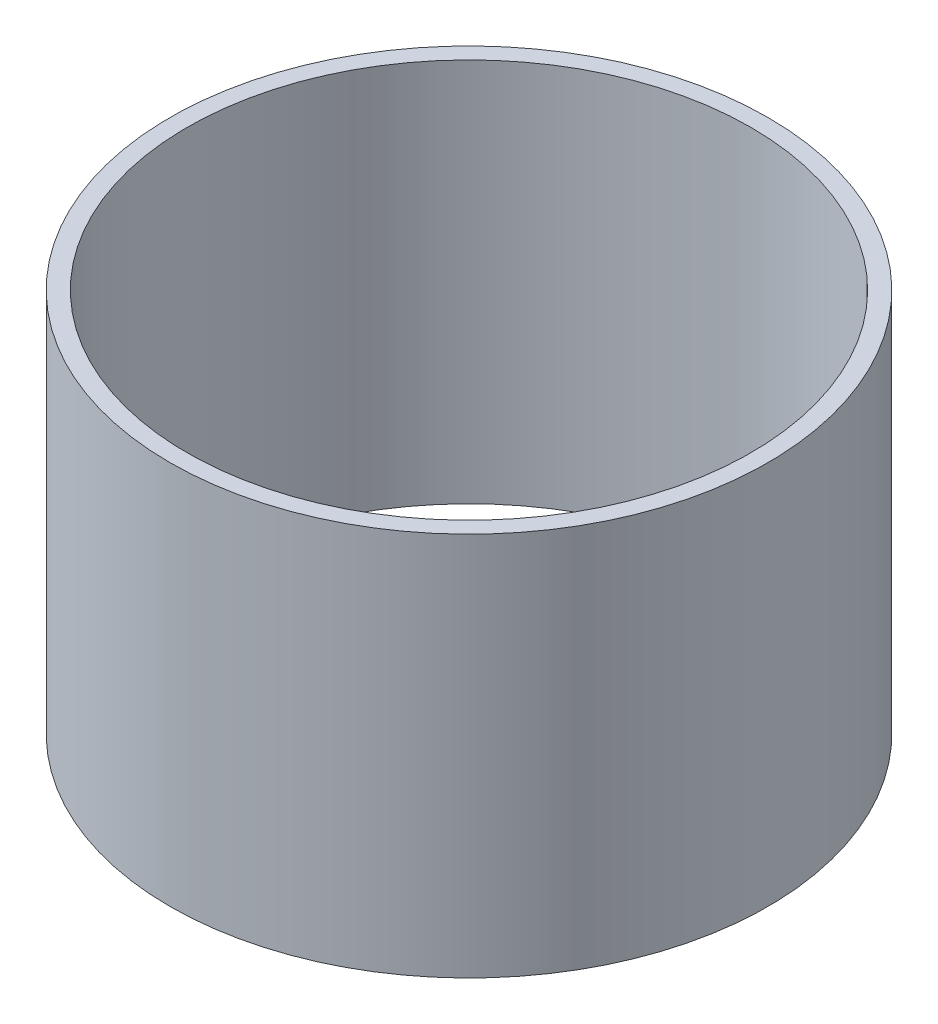
ISO-10303-21;
HEADER;
FILE_DESCRIPTION(('STEP AP214'),'2;1');
FILE_NAME('part.step','',(''),(''),'','','');
FILE_SCHEMA(('AUTOMOTIVE_DESIGN { 1 0 10303 214 1 1 1 1 }'));
ENDSEC;
DATA;
#1=APPLICATION_CONTEXT('core data for automotive mechanical design processes');
#2=APPLICATION_PROTOCOL_DEFINITION('international standard','automotive_design',2000,#1);
#3=PRODUCT_CONTEXT('',#1,'mechanical');
#4=PRODUCT('Part','Part','',(#3));
#5=PRODUCT_RELATED_PRODUCT_CATEGORY('part','',(#4));
#6=PRODUCT_DEFINITION_FORMATION('','',#4);
#7=PRODUCT_DEFINITION_CONTEXT('part definition',#1,'design');
#8=PRODUCT_DEFINITION('design','',#6,#7);
#9=PRODUCT_DEFINITION_SHAPE('','',#8);
#10=(LENGTH_UNIT() NAMED_UNIT(*) SI_UNIT(.MILLI.,.METRE.));
#11=(NAMED_UNIT(*) PLANE_ANGLE_UNIT() SI_UNIT($,.RADIAN.));
#12=(NAMED_UNIT(*) SI_UNIT($,.STERADIAN.) SOLID_ANGLE_UNIT());
#13=UNCERTAINTY_MEASURE_WITH_UNIT(LENGTH_MEASURE(1.E-05),#10,'distance_accuracy_value','');
#14=(GEOMETRIC_REPRESENTATION_CONTEXT(3) GLOBAL_UNCERTAINTY_ASSIGNED_CONTEXT((#13)) GLOBAL_UNIT_ASSIGNED_CONTEXT((#10,
#11,#12)) REPRESENTATION_CONTEXT('',''));
#15=CARTESIAN_POINT('',(0.,0.,0.));
#16=DIRECTION('',(0.,0.,1.));
#17=DIRECTION('',(1.,0.,0.));
#18=AXIS2_PLACEMENT_3D('',#15,#16,#17);
#19=CARTESIAN_POINT('',(0.,90.,0.));
#20=DIRECTION('',(0.,1.,0.));
#21=DIRECTION('',(0.,0.,1.));
#22=AXIS2_PLACEMENT_3D('',#19,#20,#21);
#23=PLANE('',#22);
#24=CARTESIAN_POINT('',(0.,90.,0.));
#25=DIRECTION('',(0.,1.,0.));
#26=DIRECTION('',(0.,0.,1.));
#27=AXIS2_PLACEMENT_3D('',#24,#25,#26);
#28=CIRCLE('',#27,70.);
#29=CARTESIAN_POINT('',(0.,90.,-70.));
#30=VERTEX_POINT('',#29);
#31=EDGE_CURVE('E10',#30,#30,#28,.T.);
#32=ORIENTED_EDGE('',*,*,#31,.T.);
#33=EDGE_LOOP('',(#32));
#34=FACE_BOUND('',#33,.T.);
#35=CARTESIAN_POINT('',(0.,90.,0.));
#36=DIRECTION('',(0.,1.,0.));
#37=DIRECTION('',(0.,0.,1.));
#38=AXIS2_PLACEMENT_3D('',#35,#36,#37);
#39=CIRCLE('',#38,66.);
#40=CARTESIAN_POINT('',(0.,90.,-66.));
#41=VERTEX_POINT('',#40);
#42=EDGE_CURVE('E46',#41,#41,#39,.T.);
#43=ORIENTED_EDGE('',*,*,#42,.F.);
#44=EDGE_LOOP('',(#43));
#45=FACE_BOUND('',#44,.T.);
#46=ADVANCED_FACE('F35',(#34,#45),#23,.T.);
#47=CARTESIAN_POINT('',(0.,0.,0.));
#48=DIRECTION('',(0.,1.,0.));
#49=DIRECTION('',(0.,0.,1.));
#50=AXIS2_PLACEMENT_3D('',#47,#48,#49);
#51=PLANE('',#50);
#52=CARTESIAN_POINT('',(0.,0.,0.));
#53=DIRECTION('',(0.,1.,0.));
#54=DIRECTION('',(0.,0.,1.));
#55=AXIS2_PLACEMENT_3D('',#52,#53,#54);
#56=CIRCLE('',#55,70.);
#57=CARTESIAN_POINT('',(0.,0.,-70.));
#58=VERTEX_POINT('',#57);
#59=EDGE_CURVE('E39',#58,#58,#56,.T.);
#60=ORIENTED_EDGE('',*,*,#59,.F.);
#61=EDGE_LOOP('',(#60));
#62=FACE_BOUND('',#61,.T.);
#63=CARTESIAN_POINT('',(0.,0.,0.));
#64=DIRECTION('',(0.,1.,0.));
#65=DIRECTION('',(0.,0.,1.));
#66=AXIS2_PLACEMENT_3D('',#63,#64,#65);
#67=CIRCLE('',#66,66.);
#68=CARTESIAN_POINT('',(0.,0.,-66.));
#69=VERTEX_POINT('',#68);
#70=EDGE_CURVE('E48',#69,#69,#67,.T.);
#71=ORIENTED_EDGE('',*,*,#70,.T.);
#72=EDGE_LOOP('',(#71));
#73=FACE_BOUND('',#72,.T.);
#74=ADVANCED_FACE('F58',(#62,#73),#51,.F.);
#75=CARTESIAN_POINT('',(0.,90.,0.));
#76=DIRECTION('',(0.,-1.,0.));
#77=DIRECTION('',(0.,0.,-1.));
#78=AXIS2_PLACEMENT_3D('',#75,#76,#77);
#79=CYLINDRICAL_SURFACE('',#78,70.);
#80=CARTESIAN_POINT('',(0.,90.,-70.));
#81=CARTESIAN_POINT('',(0.,89.0625,-70.));
#82=CARTESIAN_POINT('',(0.,88.125,-70.));
#83=CARTESIAN_POINT('',(0.,86.25,-70.));
#84=CARTESIAN_POINT('',(0.,85.3125,-70.));
#85=CARTESIAN_POINT('',(0.,83.4375,-70.));
#86=CARTESIAN_POINT('',(0.,82.5,-70.));
#87=CARTESIAN_POINT('',(0.,80.625,-70.));
#88=CARTESIAN_POINT('',(0.,79.6875,-70.));
#89=CARTESIAN_POINT('',(0.,77.8125,-70.));
#90=CARTESIAN_POINT('',(0.,76.875,-70.));
#91=CARTESIAN_POINT('',(0.,75.,-70.));
#92=CARTESIAN_POINT('',(0.,74.0625,-70.));
#93=CARTESIAN_POINT('',(0.,72.1875,-70.));
#94=CARTESIAN_POINT('',(0.,71.25,-70.));
#95=CARTESIAN_POINT('',(0.,69.375,-70.));
#96=CARTESIAN_POINT('',(0.,68.4375,-70.));
#97=CARTESIAN_POINT('',(0.,66.5625,-70.));
#98=CARTESIAN_POINT('',(0.,65.625,-70.));
#99=CARTESIAN_POINT('',(0.,63.75,-70.));
#100=CARTESIAN_POINT('',(0.,62.8125,-70.));
#101=CARTESIAN_POINT('',(0.,60.9375,-70.));
#102=CARTESIAN_POINT('',(0.,60.,-70.));
#103=CARTESIAN_POINT('',(0.,58.125,-70.));
#104=CARTESIAN_POINT('',(0.,57.1875,-70.));
#105=CARTESIAN_POINT('',(0.,55.3125,-70.));
#106=CARTESIAN_POINT('',(0.,54.375,-70.));
#107=CARTESIAN_POINT('',(0.,52.5,-70.));
#108=CARTESIAN_POINT('',(0.,51.5625,-70.));
#109=CARTESIAN_POINT('',(0.,49.6875,-70.));
#110=CARTESIAN_POINT('',(0.,48.75,-70.));
#111=CARTESIAN_POINT('',(0.,46.875,-70.));
#112=CARTESIAN_POINT('',(0.,45.9375,-70.));
#113=CARTESIAN_POINT('',(0.,44.0625,-70.));
#114=CARTESIAN_POINT('',(0.,43.125,-70.));
#115=CARTESIAN_POINT('',(0.,41.25,-70.));
#116=CARTESIAN_POINT('',(0.,40.3125,-70.));
#117=CARTESIAN_POINT('',(0.,38.4375,-70.));
#118=CARTESIAN_POINT('',(0.,37.5,-70.));
#119=CARTESIAN_POINT('',(0.,35.625,-70.));
#120=CARTESIAN_POINT('',(0.,34.6875,-70.));
#121=CARTESIAN_POINT('',(0.,32.8125,-70.));
#122=CARTESIAN_POINT('',(0.,31.875,-70.));
#123=CARTESIAN_POINT('',(0.,30.,-70.));
#124=CARTESIAN_POINT('',(0.,29.0625,-70.));
#125=CARTESIAN_POINT('',(0.,27.1875,-70.));
#126=CARTESIAN_POINT('',(0.,26.25,-70.));
#127=CARTESIAN_POINT('',(0.,24.375,-70.));
#128=CARTESIAN_POINT('',(0.,23.4375,-70.));
#129=CARTESIAN_POINT('',(0.,21.5625,-70.));
#130=CARTESIAN_POINT('',(0.,20.625,-70.));
#131=CARTESIAN_POINT('',(0.,18.75,-70.));
#132=CARTESIAN_POINT('',(0.,17.8125,-70.));
#133=CARTESIAN_POINT('',(0.,15.9375,-70.));
#134=CARTESIAN_POINT('',(0.,15.,-70.));
#135=CARTESIAN_POINT('',(0.,13.125,-70.));
#136=CARTESIAN_POINT('',(0.,12.1875,-70.));
#137=CARTESIAN_POINT('',(0.,10.3125,-70.));
#138=CARTESIAN_POINT('',(0.,9.37499999999999,-70.));
#139=CARTESIAN_POINT('',(0.,7.49999999999999,-70.));
#140=CARTESIAN_POINT('',(0.,6.56249999999999,-70.));
#141=CARTESIAN_POINT('',(0.,4.68749999999999,-70.));
#142=CARTESIAN_POINT('',(0.,3.74999999999998,-70.));
#143=CARTESIAN_POINT('',(0.,1.87499999999998,-70.));
#144=CARTESIAN_POINT('',(0.,0.937499999999986,-70.));
#145=CARTESIAN_POINT('',(0.,0.,-70.));
#146=B_SPLINE_CURVE_WITH_KNOTS('',3,(#80,#81,#82,#83,#84,#85,#86,#87,#88,#89,#90,#91,#92,#93,
#94,#95,#96,#97,#98,#99,#100,#101,#102,#103,#104,#105,#106,#107,#108,#109,#110,#111,#112,#113,
#114,#115,#116,#117,#118,#119,#120,#121,#122,#123,#124,#125,#126,#127,#128,#129,#130,#131,#132,
#133,#134,#135,#136,#137,#138,#139,#140,#141,#142,#143,#144,#145),.UNSPECIFIED.,.F.,.F.,(4,2,2,
2,2,2,2,2,2,2,2,2,2,2,2,2,2,2,2,2,2,2,2,2,2,2,2,2,2,2,2,2,4),(0.,2.8125,5.62499999999999,
8.43749999999999,11.25,14.0625,16.875,19.6875,22.5,25.3125,28.125,30.9375,33.75,36.5625,39.375,
42.1875,45.,47.8125,50.625,53.4375,56.25,59.0625,61.875,64.6875,67.5,70.3125,73.125,75.9375,
78.75,81.5625,84.375,87.1875,90.),.UNSPECIFIED.);
#147=EDGE_CURVE('BSEAM37',#30,#58,#146,.T.);
#148=ORIENTED_EDGE('',*,*,#31,.F.);
#149=ORIENTED_EDGE('',*,*,#59,.T.);
#150=ORIENTED_EDGE('',*,*,#147,.T.);
#151=ORIENTED_EDGE('',*,*,#147,.F.);
#152=EDGE_LOOP('',(#148,#150,#149,#151));
#153=FACE_BOUND('',#152,.T.);
#154=ADVANCED_FACE('F37',(#153),#79,.T.);
#155=CARTESIAN_POINT('',(0.,90.,0.));
#156=DIRECTION('',(0.,-1.,0.));
#157=DIRECTION('',(0.,0.,-1.));
#158=AXIS2_PLACEMENT_3D('',#155,#156,#157);
#159=CYLINDRICAL_SURFACE('',#158,66.);
#160=CARTESIAN_POINT('',(0.,90.,-66.));
#161=CARTESIAN_POINT('',(0.,89.0625,-66.));
#162=CARTESIAN_POINT('',(0.,88.125,-66.));
#163=CARTESIAN_POINT('',(0.,86.25,-66.));
#164=CARTESIAN_POINT('',(0.,85.3125,-66.));
#165=CARTESIAN_POINT('',(0.,83.4375,-66.));
#166=CARTESIAN_POINT('',(0.,82.5,-66.));
#167=CARTESIAN_POINT('',(0.,80.625,-66.));
#168=CARTESIAN_POINT('',(0.,79.6875,-66.));
#169=CARTESIAN_POINT('',(0.,77.8125,-66.));
#170=CARTESIAN_POINT('',(0.,76.875,-66.));
#171=CARTESIAN_POINT('',(0.,75.,-66.));
#172=CARTESIAN_POINT('',(0.,74.0625,-66.));
#173=CARTESIAN_POINT('',(0.,72.1875,-66.));
#174=CARTESIAN_POINT('',(0.,71.25,-66.));
#175=CARTESIAN_POINT('',(0.,69.375,-66.));
#176=CARTESIAN_POINT('',(0.,68.4375,-66.));
#177=CARTESIAN_POINT('',(0.,66.5625,-66.));
#178=CARTESIAN_POINT('',(0.,65.625,-66.));
#179=CARTESIAN_POINT('',(0.,63.75,-66.));
#180=CARTESIAN_POINT('',(0.,62.8125,-66.));
#181=CARTESIAN_POINT('',(0.,60.9375,-66.));
#182=CARTESIAN_POINT('',(0.,60.,-66.));
#183=CARTESIAN_POINT('',(0.,58.125,-66.));
#184=CARTESIAN_POINT('',(0.,57.1875,-66.));
#185=CARTESIAN_POINT('',(0.,55.3125,-66.));
#186=CARTESIAN_POINT('',(0.,54.375,-66.));
#187=CARTESIAN_POINT('',(0.,52.5,-66.));
#188=CARTESIAN_POINT('',(0.,51.5625,-66.));
#189=CARTESIAN_POINT('',(0.,49.6875,-66.));
#190=CARTESIAN_POINT('',(0.,48.75,-66.));
#191=CARTESIAN_POINT('',(0.,46.875,-66.));
#192=CARTESIAN_POINT('',(0.,45.9375,-66.));
#193=CARTESIAN_POINT('',(0.,44.0625,-66.));
#194=CARTESIAN_POINT('',(0.,43.125,-66.));
#195=CARTESIAN_POINT('',(0.,41.25,-66.));
#196=CARTESIAN_POINT('',(0.,40.3125,-66.));
#197=CARTESIAN_POINT('',(0.,38.4375,-66.));
#198=CARTESIAN_POINT('',(0.,37.5,-66.));
#199=CARTESIAN_POINT('',(0.,35.625,-66.));
#200=CARTESIAN_POINT('',(0.,34.6875,-66.));
#201=CARTESIAN_POINT('',(0.,32.8125,-66.));
#202=CARTESIAN_POINT('',(0.,31.875,-66.));
#203=CARTESIAN_POINT('',(0.,30.,-66.));
#204=CARTESIAN_POINT('',(0.,29.0625,-66.));
#205=CARTESIAN_POINT('',(0.,27.1875,-66.));
#206=CARTESIAN_POINT('',(0.,26.25,-66.));
#207=CARTESIAN_POINT('',(0.,24.375,-66.));
#208=CARTESIAN_POINT('',(0.,23.4375,-66.));
#209=CARTESIAN_POINT('',(0.,21.5625,-66.));
#210=CARTESIAN_POINT('',(0.,20.625,-66.));
#211=CARTESIAN_POINT('',(0.,18.75,-66.));
#212=CARTESIAN_POINT('',(0.,17.8125,-66.));
#213=CARTESIAN_POINT('',(0.,15.9375,-66.));
#214=CARTESIAN_POINT('',(0.,15.,-66.));
#215=CARTESIAN_POINT('',(0.,13.125,-66.));
#216=CARTESIAN_POINT('',(0.,12.1875,-66.));
#217=CARTESIAN_POINT('',(0.,10.3125,-66.));
#218=CARTESIAN_POINT('',(0.,9.37499999999999,-66.));
#219=CARTESIAN_POINT('',(0.,7.49999999999999,-66.));
#220=CARTESIAN_POINT('',(0.,6.56249999999999,-66.));
#221=CARTESIAN_POINT('',(0.,4.68749999999999,-66.));
#222=CARTESIAN_POINT('',(0.,3.74999999999998,-66.));
#223=CARTESIAN_POINT('',(0.,1.87499999999998,-66.));
#224=CARTESIAN_POINT('',(0.,0.937499999999986,-66.));
#225=CARTESIAN_POINT('',(0.,0.,-66.));
#226=B_SPLINE_CURVE_WITH_KNOTS('',3,(#160,#161,#162,#163,#164,#165,#166,#167,#168,#169,#170,
#171,#172,#173,#174,#175,#176,#177,#178,#179,#180,#181,#182,#183,#184,#185,#186,#187,#188,#189,
#190,#191,#192,#193,#194,#195,#196,#197,#198,#199,#200,#201,#202,#203,#204,#205,#206,#207,#208,
#209,#210,#211,#212,#213,#214,#215,#216,#217,#218,#219,#220,#221,#222,#223,#224,#225),
.UNSPECIFIED.,.F.,.F.,(4,2,2,2,2,2,2,2,2,2,2,2,2,2,2,2,2,2,2,2,2,2,2,2,2,2,2,2,2,2,2,2,4),(0.,
2.8125,5.62499999999999,8.43749999999999,11.25,14.0625,16.875,19.6875,22.5,25.3125,28.125,
30.9375,33.75,36.5625,39.375,42.1875,45.,47.8125,50.625,53.4375,56.25,59.0625,61.875,64.6875,
67.5,70.3125,73.125,75.9375,78.75,81.5625,84.375,87.1875,90.),.UNSPECIFIED.);
#227=EDGE_CURVE('BSEAM54',#41,#69,#226,.T.);
#228=ORIENTED_EDGE('',*,*,#42,.T.);
#229=ORIENTED_EDGE('',*,*,#70,.F.);
#230=ORIENTED_EDGE('',*,*,#227,.T.);
#231=ORIENTED_EDGE('',*,*,#227,.F.);
#232=EDGE_LOOP('',(#228,#230,#229,#231));
#233=FACE_BOUND('',#232,.T.);
#234=ADVANCED_FACE('F54',(#233),#159,.F.);
#235=CLOSED_SHELL('',(#46,#74,#154,#234));
#236=MANIFOLD_SOLID_BREP('B2',#235);
#237=ADVANCED_BREP_SHAPE_REPRESENTATION('',(#18,#236),#14);
#238=SHAPE_DEFINITION_REPRESENTATION(#9,#237);
ENDSEC;
END-ISO-10303-21;
